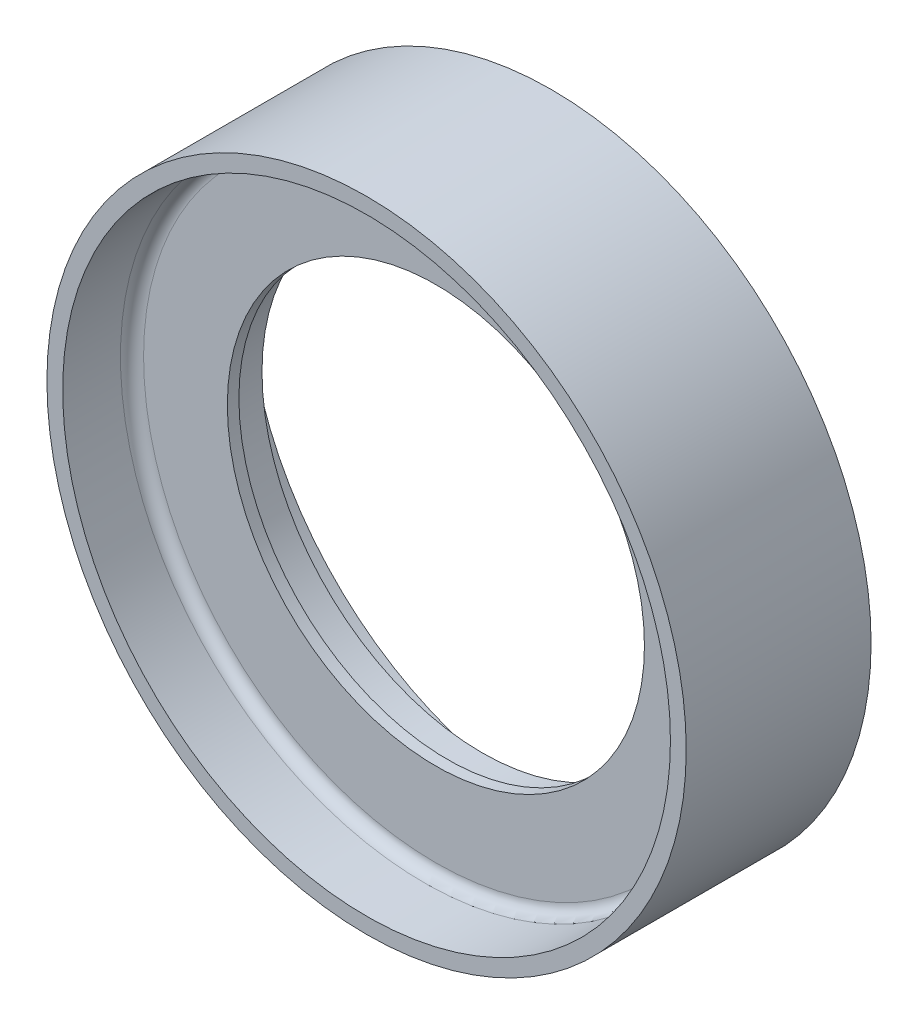
ISO-10303-21;
HEADER;
FILE_DESCRIPTION(('STEP AP214'),'2;1');
FILE_NAME('part.step','',(''),(''),'','','');
FILE_SCHEMA(('AUTOMOTIVE_DESIGN { 1 0 10303 214 1 1 1 1 }'));
ENDSEC;
DATA;
#1=APPLICATION_CONTEXT('core data for automotive mechanical design processes');
#2=APPLICATION_PROTOCOL_DEFINITION('international standard','automotive_design',2000,#1);
#3=PRODUCT_CONTEXT('',#1,'mechanical');
#4=PRODUCT('Part','Part','',(#3));
#5=PRODUCT_RELATED_PRODUCT_CATEGORY('part','',(#4));
#6=PRODUCT_DEFINITION_FORMATION('','',#4);
#7=PRODUCT_DEFINITION_CONTEXT('part definition',#1,'design');
#8=PRODUCT_DEFINITION('design','',#6,#7);
#9=PRODUCT_DEFINITION_SHAPE('','',#8);
#10=(LENGTH_UNIT() NAMED_UNIT(*) SI_UNIT(.MILLI.,.METRE.));
#11=(NAMED_UNIT(*) PLANE_ANGLE_UNIT() SI_UNIT($,.RADIAN.));
#12=(NAMED_UNIT(*) SI_UNIT($,.STERADIAN.) SOLID_ANGLE_UNIT());
#13=UNCERTAINTY_MEASURE_WITH_UNIT(LENGTH_MEASURE(1.E-05),#10,'distance_accuracy_value','');
#14=(GEOMETRIC_REPRESENTATION_CONTEXT(3) GLOBAL_UNCERTAINTY_ASSIGNED_CONTEXT((#13)) GLOBAL_UNIT_ASSIGNED_CONTEXT((#10,
#11,#12)) REPRESENTATION_CONTEXT('',''));
#15=CARTESIAN_POINT('',(0.,0.,0.));
#16=DIRECTION('',(0.,0.,1.));
#17=DIRECTION('',(1.,0.,0.));
#18=AXIS2_PLACEMENT_3D('',#15,#16,#17);
#19=CARTESIAN_POINT('',(0.,0.,2.));
#20=DIRECTION('',(0.,0.,-1.));
#21=DIRECTION('',(-1.,0.,0.));
#22=AXIS2_PLACEMENT_3D('',#19,#20,#21);
#23=CYLINDRICAL_SURFACE('',#22,9.025);
#24=CARTESIAN_POINT('',(0.,0.,2.));
#25=DIRECTION('',(0.,0.,1.));
#26=DIRECTION('',(1.,0.,0.));
#27=AXIS2_PLACEMENT_3D('',#24,#25,#26);
#28=CIRCLE('',#27,9.025);
#29=CARTESIAN_POINT('',(9.025,0.,2.));
#30=VERTEX_POINT('',#29);
#31=EDGE_CURVE('E70',#30,#30,#28,.T.);
#32=ORIENTED_EDGE('',*,*,#31,.T.);
#33=EDGE_LOOP('',(#32));
#34=FACE_BOUND('',#33,.T.);
#35=CARTESIAN_POINT('',(0.,0.,1.5));
#36=DIRECTION('',(0.,0.,-1.));
#37=DIRECTION('',(-1.,0.,0.));
#38=AXIS2_PLACEMENT_3D('',#35,#36,#37);
#39=CIRCLE('',#38,9.025);
#40=CARTESIAN_POINT('',(-9.025,0.,1.5));
#41=VERTEX_POINT('',#40);
#42=EDGE_CURVE('E48',#41,#41,#39,.T.);
#43=ORIENTED_EDGE('',*,*,#42,.T.);
#44=EDGE_LOOP('',(#43));
#45=FACE_BOUND('',#44,.T.);
#46=ADVANCED_FACE('F44',(#34,#45),#23,.F.);
#47=CARTESIAN_POINT('',(0.,0.,2.));
#48=DIRECTION('',(0.,0.,1.));
#49=DIRECTION('',(1.,0.,0.));
#50=AXIS2_PLACEMENT_3D('',#47,#48,#49);
#51=PLANE('',#50);
#52=CARTESIAN_POINT('',(0.,0.,2.));
#53=DIRECTION('',(0.,0.,1.));
#54=DIRECTION('',(1.,0.,0.));
#55=AXIS2_PLACEMENT_3D('',#52,#53,#54);
#56=CIRCLE('',#55,12.65);
#57=CARTESIAN_POINT('',(12.65,0.,2.));
#58=VERTEX_POINT('',#57);
#59=EDGE_CURVE('E12',#58,#58,#56,.T.);
#60=ORIENTED_EDGE('',*,*,#59,.T.);
#61=EDGE_LOOP('',(#60));
#62=FACE_BOUND('',#61,.T.);
#63=ORIENTED_EDGE('',*,*,#31,.F.);
#64=EDGE_LOOP('',(#63));
#65=FACE_BOUND('',#64,.T.);
#66=ADVANCED_FACE('F100',(#62,#65),#51,.T.);
#67=CARTESIAN_POINT('',(0.,0.,-3.));
#68=DIRECTION('',(0.,0.,1.));
#69=DIRECTION('',(1.,0.,0.));
#70=AXIS2_PLACEMENT_3D('',#67,#68,#69);
#71=CYLINDRICAL_SURFACE('',#70,13.8327);
#72=CARTESIAN_POINT('',(0.,0.,-3.));
#73=DIRECTION('',(0.,0.,1.));
#74=DIRECTION('',(1.,0.,0.));
#75=AXIS2_PLACEMENT_3D('',#72,#73,#74);
#76=CIRCLE('',#75,13.8327);
#77=CARTESIAN_POINT('',(13.8327,0.,-3.));
#78=VERTEX_POINT('',#77);
#79=EDGE_CURVE('E64',#78,#78,#76,.T.);
#80=ORIENTED_EDGE('',*,*,#79,.T.);
#81=EDGE_LOOP('',(#80));
#82=FACE_BOUND('',#81,.T.);
#83=CARTESIAN_POINT('',(0.,0.,5.));
#84=DIRECTION('',(0.,0.,1.));
#85=DIRECTION('',(1.,0.,0.));
#86=AXIS2_PLACEMENT_3D('',#83,#84,#85);
#87=CIRCLE('',#86,13.8327);
#88=CARTESIAN_POINT('',(13.8327,0.,5.));
#89=VERTEX_POINT('',#88);
#90=EDGE_CURVE('E73',#89,#89,#87,.T.);
#91=ORIENTED_EDGE('',*,*,#90,.F.);
#92=EDGE_LOOP('',(#91));
#93=FACE_BOUND('',#92,.T.);
#94=ADVANCED_FACE('F106',(#82,#93),#71,.T.);
#95=CARTESIAN_POINT('',(0.,0.,-3.));
#96=DIRECTION('',(0.,0.,1.));
#97=DIRECTION('',(1.,0.,0.));
#98=AXIS2_PLACEMENT_3D('',#95,#96,#97);
#99=PLANE('',#98);
#100=CARTESIAN_POINT('',(0.,0.,-3.));
#101=DIRECTION('',(0.,0.,1.));
#102=DIRECTION('',(1.,0.,0.));
#103=AXIS2_PLACEMENT_3D('',#100,#101,#102);
#104=CIRCLE('',#103,13.15);
#105=CARTESIAN_POINT('',(13.15,0.,-3.));
#106=VERTEX_POINT('',#105);
#107=EDGE_CURVE('E67',#106,#106,#104,.T.);
#108=ORIENTED_EDGE('',*,*,#107,.T.);
#109=EDGE_LOOP('',(#108));
#110=FACE_BOUND('',#109,.T.);
#111=ORIENTED_EDGE('',*,*,#79,.F.);
#112=EDGE_LOOP('',(#111));
#113=FACE_BOUND('',#112,.T.);
#114=ADVANCED_FACE('F119',(#110,#113),#99,.F.);
#115=CARTESIAN_POINT('',(0.,0.,-3.));
#116=DIRECTION('',(0.,0.,1.));
#117=DIRECTION('',(1.,0.,0.));
#118=AXIS2_PLACEMENT_3D('',#115,#116,#117);
#119=CYLINDRICAL_SURFACE('',#118,13.15);
#120=CARTESIAN_POINT('',(0.,0.,-0.5));
#121=DIRECTION('',(0.,0.,1.));
#122=DIRECTION('',(1.,0.,0.));
#123=AXIS2_PLACEMENT_3D('',#120,#121,#122);
#124=CIRCLE('',#123,13.15);
#125=CARTESIAN_POINT('',(13.15,0.,-0.5));
#126=VERTEX_POINT('',#125);
#127=EDGE_CURVE('E61',#126,#126,#124,.T.);
#128=ORIENTED_EDGE('',*,*,#127,.T.);
#129=EDGE_LOOP('',(#128));
#130=FACE_BOUND('',#129,.T.);
#131=ORIENTED_EDGE('',*,*,#107,.F.);
#132=EDGE_LOOP('',(#131));
#133=FACE_BOUND('',#132,.T.);
#134=ADVANCED_FACE('F115',(#130,#133),#119,.F.);
#135=CARTESIAN_POINT('',(0.,0.,0.));
#136=DIRECTION('',(0.,0.,1.));
#137=DIRECTION('',(1.,0.,0.));
#138=AXIS2_PLACEMENT_3D('',#135,#136,#137);
#139=PLANE('',#138);
#140=CARTESIAN_POINT('',(0.,0.,0.));
#141=DIRECTION('',(0.,0.,-1.));
#142=DIRECTION('',(-1.,0.,0.));
#143=AXIS2_PLACEMENT_3D('',#140,#141,#142);
#144=CIRCLE('',#143,9.525);
#145=CARTESIAN_POINT('',(-9.525,0.,0.));
#146=VERTEX_POINT('',#145);
#147=EDGE_CURVE('E79',#146,#146,#144,.T.);
#148=ORIENTED_EDGE('',*,*,#147,.F.);
#149=EDGE_LOOP('',(#148));
#150=FACE_BOUND('',#149,.T.);
#151=CARTESIAN_POINT('',(0.,0.,0.));
#152=DIRECTION('',(0.,0.,1.));
#153=DIRECTION('',(1.,0.,0.));
#154=AXIS2_PLACEMENT_3D('',#151,#152,#153);
#155=CIRCLE('',#154,12.65);
#156=CARTESIAN_POINT('',(12.65,0.,0.));
#157=VERTEX_POINT('',#156);
#158=EDGE_CURVE('E56',#157,#157,#155,.F.);
#159=ORIENTED_EDGE('',*,*,#158,.T.);
#160=EDGE_LOOP('',(#159));
#161=FACE_BOUND('',#160,.T.);
#162=ADVANCED_FACE('F112',(#150,#161),#139,.F.);
#163=CARTESIAN_POINT('',(0.,0.,5.));
#164=DIRECTION('',(0.,0.,1.));
#165=DIRECTION('',(1.,0.,0.));
#166=AXIS2_PLACEMENT_3D('',#163,#164,#165);
#167=PLANE('',#166);
#168=ORIENTED_EDGE('',*,*,#90,.T.);
#169=EDGE_LOOP('',(#168));
#170=FACE_BOUND('',#169,.T.);
#171=CARTESIAN_POINT('',(0.,0.,5.));
#172=DIRECTION('',(0.,0.,1.));
#173=DIRECTION('',(1.,0.,0.));
#174=AXIS2_PLACEMENT_3D('',#171,#172,#173);
#175=CIRCLE('',#174,13.15);
#176=CARTESIAN_POINT('',(13.15,0.,5.));
#177=VERTEX_POINT('',#176);
#178=EDGE_CURVE('E76',#177,#177,#175,.T.);
#179=ORIENTED_EDGE('',*,*,#178,.F.);
#180=EDGE_LOOP('',(#179));
#181=FACE_BOUND('',#180,.T.);
#182=ADVANCED_FACE('F109',(#170,#181),#167,.T.);
#183=CARTESIAN_POINT('',(0.,0.,5.));
#184=DIRECTION('',(0.,0.,-1.));
#185=DIRECTION('',(-1.,0.,0.));
#186=AXIS2_PLACEMENT_3D('',#183,#184,#185);
#187=CYLINDRICAL_SURFACE('',#186,13.15);
#188=CARTESIAN_POINT('',(0.,0.,2.5));
#189=DIRECTION('',(0.,0.,1.));
#190=DIRECTION('',(1.,0.,0.));
#191=AXIS2_PLACEMENT_3D('',#188,#189,#190);
#192=CIRCLE('',#191,13.15);
#193=CARTESIAN_POINT('',(13.15,0.,2.5));
#194=VERTEX_POINT('',#193);
#195=EDGE_CURVE('E52',#194,#194,#192,.F.);
#196=ORIENTED_EDGE('',*,*,#195,.T.);
#197=EDGE_LOOP('',(#196));
#198=FACE_BOUND('',#197,.T.);
#199=ORIENTED_EDGE('',*,*,#178,.T.);
#200=EDGE_LOOP('',(#199));
#201=FACE_BOUND('',#200,.T.);
#202=ADVANCED_FACE('F128',(#198,#201),#187,.F.);
#203=CARTESIAN_POINT('',(0.,0.,-0.5));
#204=DIRECTION('',(0.,0.,1.));
#205=DIRECTION('',(1.,0.,0.));
#206=AXIS2_PLACEMENT_3D('',#203,#204,#205);
#207=TOROIDAL_SURFACE('',#206,12.65,0.5);
#208=ORIENTED_EDGE('',*,*,#158,.F.);
#209=EDGE_LOOP('',(#208));
#210=FACE_BOUND('',#209,.T.);
#211=ORIENTED_EDGE('',*,*,#127,.F.);
#212=EDGE_LOOP('',(#211));
#213=FACE_BOUND('',#212,.T.);
#214=ADVANCED_FACE('F126',(#210,#213),#207,.F.);
#215=CARTESIAN_POINT('',(0.,0.,2.5));
#216=DIRECTION('',(0.,0.,1.));
#217=DIRECTION('',(1.,0.,0.));
#218=AXIS2_PLACEMENT_3D('',#215,#216,#217);
#219=TOROIDAL_SURFACE('',#218,12.65,0.5);
#220=ORIENTED_EDGE('',*,*,#59,.F.);
#221=EDGE_LOOP('',(#220));
#222=FACE_BOUND('',#221,.T.);
#223=ORIENTED_EDGE('',*,*,#195,.F.);
#224=EDGE_LOOP('',(#223));
#225=FACE_BOUND('',#224,.T.);
#226=ADVANCED_FACE('F46',(#222,#225),#219,.F.);
#227=CARTESIAN_POINT('',(0.,0.,1.5));
#228=DIRECTION('',(0.,0.,-1.));
#229=DIRECTION('',(-1.,0.,0.));
#230=AXIS2_PLACEMENT_3D('',#227,#228,#229);
#231=CYLINDRICAL_SURFACE('',#230,9.525);
#232=CARTESIAN_POINT('',(0.,0.,1.5));
#233=DIRECTION('',(0.,0.,-1.));
#234=DIRECTION('',(-1.,0.,0.));
#235=AXIS2_PLACEMENT_3D('',#232,#233,#234);
#236=CIRCLE('',#235,9.525);
#237=CARTESIAN_POINT('',(-9.525,0.,1.5));
#238=VERTEX_POINT('',#237);
#239=EDGE_CURVE('E82',#238,#238,#236,.T.);
#240=ORIENTED_EDGE('',*,*,#239,.F.);
#241=EDGE_LOOP('',(#240));
#242=FACE_BOUND('',#241,.T.);
#243=ORIENTED_EDGE('',*,*,#147,.T.);
#244=EDGE_LOOP('',(#243));
#245=FACE_BOUND('',#244,.T.);
#246=ADVANCED_FACE('F92',(#242,#245),#231,.F.);
#247=CARTESIAN_POINT('',(0.,0.,1.5));
#248=DIRECTION('',(0.,0.,-1.));
#249=DIRECTION('',(-1.,0.,0.));
#250=AXIS2_PLACEMENT_3D('',#247,#248,#249);
#251=PLANE('',#250);
#252=ORIENTED_EDGE('',*,*,#42,.F.);
#253=EDGE_LOOP('',(#252));
#254=FACE_BOUND('',#253,.T.);
#255=ORIENTED_EDGE('',*,*,#239,.T.);
#256=EDGE_LOOP('',(#255));
#257=FACE_BOUND('',#256,.T.);
#258=ADVANCED_FACE('F90',(#254,#257),#251,.T.);
#259=CLOSED_SHELL('',(#46,#66,#94,#114,#134,#162,#182,#202,#214,#226,#246,#258));
#260=MANIFOLD_SOLID_BREP('B2',#259);
#261=ADVANCED_BREP_SHAPE_REPRESENTATION('',(#18,#260),#14);
#262=SHAPE_DEFINITION_REPRESENTATION(#9,#261);
ENDSEC;
END-ISO-10303-21;
